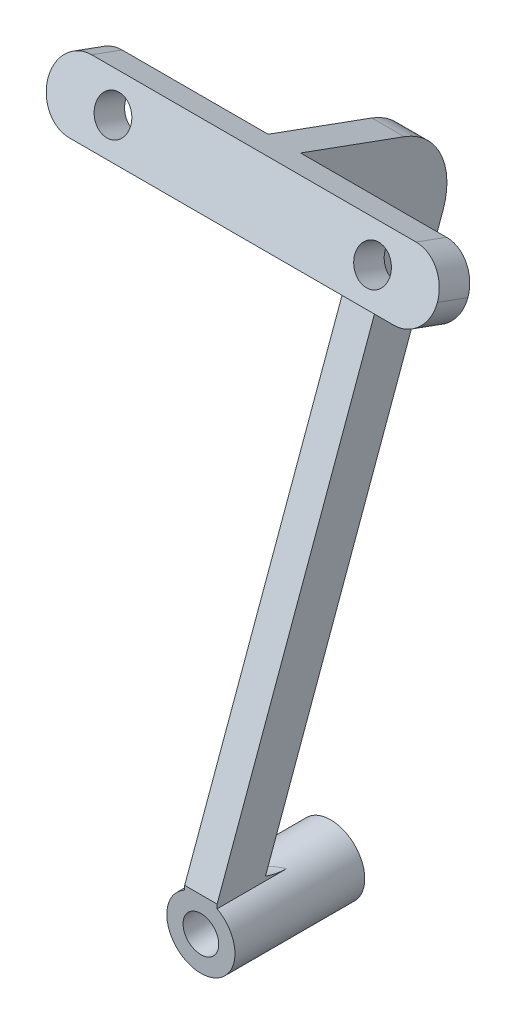
ISO-10303-21;
HEADER;
FILE_DESCRIPTION(('STEP AP214'),'2;1');
FILE_NAME('part.step','',(''),(''),'','','');
FILE_SCHEMA(('AUTOMOTIVE_DESIGN { 1 0 10303 214 1 1 1 1 }'));
ENDSEC;
DATA;
#1=APPLICATION_CONTEXT('core data for automotive mechanical design processes');
#2=APPLICATION_PROTOCOL_DEFINITION('international standard','automotive_design',2000,#1);
#3=PRODUCT_CONTEXT('',#1,'mechanical');
#4=PRODUCT('Part','Part','',(#3));
#5=PRODUCT_RELATED_PRODUCT_CATEGORY('part','',(#4));
#6=PRODUCT_DEFINITION_FORMATION('','',#4);
#7=PRODUCT_DEFINITION_CONTEXT('part definition',#1,'design');
#8=PRODUCT_DEFINITION('design','',#6,#7);
#9=PRODUCT_DEFINITION_SHAPE('','',#8);
#10=(LENGTH_UNIT() NAMED_UNIT(*) SI_UNIT(.MILLI.,.METRE.));
#11=(NAMED_UNIT(*) PLANE_ANGLE_UNIT() SI_UNIT($,.RADIAN.));
#12=(NAMED_UNIT(*) SI_UNIT($,.STERADIAN.) SOLID_ANGLE_UNIT());
#13=UNCERTAINTY_MEASURE_WITH_UNIT(LENGTH_MEASURE(1.E-05),#10,'distance_accuracy_value','');
#14=(GEOMETRIC_REPRESENTATION_CONTEXT(3) GLOBAL_UNCERTAINTY_ASSIGNED_CONTEXT((#13)) GLOBAL_UNIT_ASSIGNED_CONTEXT((#10,
#11,#12)) REPRESENTATION_CONTEXT('',''));
#15=CARTESIAN_POINT('',(0.,0.,0.));
#16=DIRECTION('',(0.,0.,1.));
#17=DIRECTION('',(1.,0.,0.));
#18=AXIS2_PLACEMENT_3D('',#15,#16,#17);
#19=CARTESIAN_POINT('',(-2.5,-5.251,20.));
#20=DIRECTION('',(1.,0.,0.));
#21=DIRECTION('',(0.,0.,-1.));
#22=AXIS2_PLACEMENT_3D('',#19,#20,#21);
#23=PLANE('',#22);
#24=DIRECTION('',(0.,-0.342020143325673,-0.939692620785907));
#25=VECTOR('',#24,1.);
#26=CARTESIAN_POINT('',(-2.5,85.1744674403331,-31.0009708677575));
#27=LINE('',#26,#25);
#28=CARTESIAN_POINT('',(-2.5,99.0568797405248,7.14064345457762));
#29=VERTEX_POINT('',#28);
#30=CARTESIAN_POINT('',(-2.5,93.2425373039883,-8.83413109878284));
#31=VERTEX_POINT('',#30);
#32=EDGE_CURVE('E200',#29,#31,#27,.T.);
#33=ORIENTED_EDGE('',*,*,#32,.T.);
#34=CARTESIAN_POINT('',(-2.5,83.8456110961293,-5.41392966552613));
#35=DIRECTION('',(1.,0.,0.));
#36=DIRECTION('',(0.,0.,-1.));
#37=AXIS2_PLACEMENT_3D('',#34,#35,#36);
#38=CIRCLE('',#37,10.);
#39=CARTESIAN_POINT('',(-2.5,80.4254096628726,-14.8108558733852));
#40=VERTEX_POINT('',#39);
#41=EDGE_CURVE('E240',#31,#40,#38,.F.);
#42=ORIENTED_EDGE('',*,*,#41,.T.);
#43=DIRECTION('',(0.,0.939692620785907,-0.342020143325673));
#44=VECTOR('',#43,1.);
#45=CARTESIAN_POINT('',(-2.5,4.64786843039844,12.7699135611156));
#46=LINE('',#45,#44);
#47=CARTESIAN_POINT('',(-2.5,5.25,12.5507555926686));
#48=VERTEX_POINT('',#47);
#49=EDGE_CURVE('E208',#48,#40,#46,.T.);
#50=ORIENTED_EDGE('',*,*,#49,.F.);
#51=CARTESIAN_POINT('',(0.,5.25,12.5507555926686));
#52=CARTESIAN_POINT('',(0.,5.25,12.5507555926686));
#53=CARTESIAN_POINT('',(0.,5.25,12.5507555926686));
#54=CARTESIAN_POINT('',(-0.00553342975282039,5.25,12.5507555926686));
#55=CARTESIAN_POINT('',(-0.00418381272475795,5.25000002703478,12.5488232350496));
#56=CARTESIAN_POINT('',(-0.00283419572705482,5.24999999850781,12.5468908780633));
#57=CARTESIAN_POINT('',(-0.0110669032605803,5.25,12.5507555926686));
#58=CARTESIAN_POINT('',(-0.00836766133980388,5.2499955453821,12.5468908609932));
#59=CARTESIAN_POINT('',(-0.00566841386517574,5.24999770351182,12.5430261325125));
#60=CARTESIAN_POINT('',(-0.36287299616643,5.25,12.5507555926686));
#61=CARTESIAN_POINT('',(-0.274377801040332,5.24942408783464,12.4240306705765));
#62=CARTESIAN_POINT('',(-0.185861778524241,5.24970596208985,12.2973143297875));
#63=CARTESIAN_POINT('',(-0.709301719851265,5.25,12.5507555926686));
#64=CARTESIAN_POINT('',(-0.536964722483506,5.2311889981498,12.3027906785226));
#65=CARTESIAN_POINT('',(-0.363300880897622,5.24043658856924,12.0553725040121));
#66=CARTESIAN_POINT('',(-1.4008943284433,5.25,12.5507555926686));
#67=CARTESIAN_POINT('',(-1.05574310249139,5.16001576655704,12.068202499425));
#68=CARTESIAN_POINT('',(-0.717531241399588,5.20378678969846,11.5743758696895));
#69=CARTESIAN_POINT('',(-1.74605671865242,5.25,12.5507555926686));
#70=CARTESIAN_POINT('',(-1.31326128969685,5.10667090515502,11.9542859496197));
#71=CARTESIAN_POINT('',(-0.894321733951118,5.17638935150038,11.3353239880996));
#72=CARTESIAN_POINT('',(-2.43325084165303,5.25,12.5507555926686));
#73=CARTESIAN_POINT('',(-1.81615321784004,4.96671404735562,11.7420890877089));
#74=CARTESIAN_POINT('',(-1.24629921157118,5.10309224864686,10.8635405964318));
#75=CARTESIAN_POINT('',(-2.77528269156858,5.25,12.5507555926686));
#76=CARTESIAN_POINT('',(-2.06273634263074,4.8793706516017,11.6434117235311));
#77=CARTESIAN_POINT('',(-1.42148625663009,5.05719327911377,10.6308088492503));
#78=CARTESIAN_POINT('',(-3.45398178233707,5.25,12.5507555926686));
#79=CARTESIAN_POINT('',(-2.53700064518898,4.6742541443722,11.4703669371185));
#80=CARTESIAN_POINT('',(-1.76911262018755,4.94631005022254,10.1756619095447));
#81=CARTESIAN_POINT('',(-3.79065457458332,5.25,12.5507555926686));
#82=CARTESIAN_POINT('',(-2.76567013103482,4.55546096238637,11.3959062264544));
#83=CARTESIAN_POINT('',(-1.94155478208264,4.88134710749936,9.95323551388124));
#84=CARTESIAN_POINT('',(-4.32982969634834,5.25,12.5507555926686));
#85=CARTESIAN_POINT('',(-3.11301366596122,4.34371398137302,11.3031729765876));
#86=CARTESIAN_POINT('',(-2.21771764936217,4.75999456349973,9.60499620939088));
#87=CARTESIAN_POINT('',(-4.53468524509315,5.25,12.5507555926686));
#88=CARTESIAN_POINT('',(-3.24152457220835,4.2571737597041,11.274198038496));
#89=CARTESIAN_POINT('',(-2.32264366215005,4.70973310616259,9.47459807314129));
#90=CARTESIAN_POINT('',(-4.96344155898174,5.25,12.5507555926686));
#91=CARTESIAN_POINT('',(-3.49997521621392,4.06621960161026,11.2295664360153));
#92=CARTESIAN_POINT('',(-2.54225055456799,4.59526418037215,9.20671117300475));
#93=CARTESIAN_POINT('',(-5.18692339187712,5.25,12.5507555926686));
#94=CARTESIAN_POINT('',(-3.62827635981799,3.96068359938063,11.2160742604182));
#95=CARTESIAN_POINT('',(-2.65671685913333,4.53012704278603,9.07004936159981));
#96=CARTESIAN_POINT('',(-5.62819464803826,5.25,12.5507555926686));
#97=CARTESIAN_POINT('',(-3.8658974509558,3.74458075863057,11.2122147202418));
#98=CARTESIAN_POINT('',(-2.88273384406418,4.38976566433096,8.80772461836784));
#99=CARTESIAN_POINT('',(-5.84598467948027,5.25,12.5507555926686));
#100=CARTESIAN_POINT('',(-3.97508980020116,3.63366591031011,11.2223243755363));
#101=CARTESIAN_POINT('',(-2.99428483593457,4.31454250647529,8.68206050802444));
#102=CARTESIAN_POINT('',(-6.27684830527241,5.25,12.5507555926686));
#103=CARTESIAN_POINT('',(-4.17152345502315,3.41201766887106,11.2696910700895));
#104=CARTESIAN_POINT('',(-3.21497108308392,4.15275594627297,8.44309098421151));
#105=CARTESIAN_POINT('',(-6.48984022712729,5.25,12.5507555926686));
#106=CARTESIAN_POINT('',(-4.25810542584749,3.30114444733093,11.3079552056831));
#107=CARTESIAN_POINT('',(-3.32406450610329,4.066073438173,8.32994216363537));
#108=CARTESIAN_POINT('',(-6.90673929801625,5.25,12.5507555926686));
#109=CARTESIAN_POINT('',(-4.40412516384092,3.09105882786623,11.4140355104022));
#110=CARTESIAN_POINT('',(-3.53759817623991,3.88173036544261,8.12123388599514));
#111=CARTESIAN_POINT('',(-7.11063084682752,5.25,12.5507555926686));
#112=CARTESIAN_POINT('',(-4.46288059805264,2.99204548969485,11.4827637294919));
#113=CARTESIAN_POINT('',(-3.64203043299983,3.78405188972199,8.02570381535891));
#114=CARTESIAN_POINT('',(-7.30872896155708,5.25,12.5507555926686));
#115=CARTESIAN_POINT('',(-4.50484645781398,2.90655538373677,11.5663403075083));
#116=CARTESIAN_POINT('',(-3.74349532177313,3.68086168931444,7.94096344285839));
#117=(BOUNDED_SURFACE() B_SPLINE_SURFACE(3,2,((#51,#52,#53),(#54,#55,#56),(#57,#58,#59),(#60,
#61,#62),(#63,#64,#65),(#66,#67,#68),(#69,#70,#71),(#72,#73,#74),(#75,#76,#77),(#78,#79,#80),
(#81,#82,#83),(#84,#85,#86),(#87,#88,#89),(#90,#91,#92),(#93,#94,#95),(#96,#97,#98),(#99,#100,
#101),(#102,#103,#104),(#105,#106,#107),(#108,#109,#110),(#111,#112,#113),(#114,#115,#116)),
.UNSPECIFIED.,.F.,.F.,.F.) B_SPLINE_SURFACE_WITH_KNOTS((4,2,2,2,2,2,2,2,2,2,4),(3,3),(0.,
0.0202484611934928,1.28734341605146,2.55562920553875,3.82386734861048,5.09069276285007,
5.87595797452175,6.74865211018151,7.62125261291826,8.50376477870381,9.38773583737556),(0.,1.),
.UNSPECIFIED.) GEOMETRIC_REPRESENTATION_ITEM() RATIONAL_B_SPLINE_SURFACE(((1.,1.,1.),(1.,
1.0000000002927,1.),(1.,0.9999996669557,1.),(1.,0.999957263650876,1.),(1.,0.998609099828485,1.),
(1.,0.993302577997672,1.),(1.,0.989341768080813,1.),(1.,0.978829391228942,1.),(1.,
0.972277921627967,1.),(1.,0.956640507178793,1.),(1.,0.94755739368857,1.),(1.,0.930889619163092,
1.),(1.,0.924047858478959,1.),(1.,0.908672914432254,1.),(1.,0.900036223144658,1.),(1.,
0.8817836776441,1.),(1.,0.87216792858671,1.),(1.,0.851999747337295,1.),(1.,0.841437916221261,
1.),(1.,0.819744977077257,1.),(1.,0.808612956833077,1.),(1.,0.797350176467293,1.))) REPRESENTATION_ITEM('') SURFACE());
#118=CARTESIAN_POINT('',(-2.5,5.25,12.5507555926686));
#119=CARTESIAN_POINT('',(-2.5,5.20123540039477,12.4186239600091));
#120=CARTESIAN_POINT('',(-2.5,5.15507246240411,12.2855342504619));
#121=CARTESIAN_POINT('',(-2.5,5.06797953116687,12.0176567952337));
#122=CARTESIAN_POINT('',(-2.5,5.02704941147575,11.8828690906692));
#123=CARTESIAN_POINT('',(-2.5,4.95072739576637,11.6127911650898));
#124=CARTESIAN_POINT('',(-2.5,4.91529745484317,11.4775116940587));
#125=CARTESIAN_POINT('',(-2.5,4.84976854443575,11.2056550244644));
#126=CARTESIAN_POINT('',(-2.5,4.81966996580496,11.0690777315278));
#127=CARTESIAN_POINT('',(-2.5,4.76506522078445,10.7947128272488));
#128=CARTESIAN_POINT('',(-2.5,4.74056269103237,10.6569244889481));
#129=CARTESIAN_POINT('',(-2.5,4.6976196652654,10.3804272396534));
#130=CARTESIAN_POINT('',(-2.5,4.6791780569643,10.2417185023409));
#131=CARTESIAN_POINT('',(-2.5,4.64883010635834,9.9625537754421));
#132=CARTESIAN_POINT('',(-2.5,4.63697206033586,9.82209240707794));
#133=CARTESIAN_POINT('',(-2.5,4.62084546195926,9.54065814823677));
#134=CARTESIAN_POINT('',(-2.5,4.61658143811805,9.39968500274315));
#135=CARTESIAN_POINT('',(-2.5,4.61654632815485,9.25865962318365));
#136=B_SPLINE_CURVE_WITH_KNOTS('',3,(#118,#119,#120,#121,#122,#123,#124,#125,#126,#127,#128,
#129,#130,#131,#132,#133,#134,#135),.UNSPECIFIED.,.F.,.F.,(4,2,2,2,2,2,2,2,4),(0.,
0.422498815114254,0.844987419141227,1.2644092063015,1.68386172944417,2.10358606646129,
2.52323333357745,2.94591972858706,3.36885809819478),.UNSPECIFIED.);
#137=CARTESIAN_POINT('',(-2.5,4.61654632815485,9.25865962318365));
#138=VERTEX_POINT('',#137);
#139=EDGE_CURVE('E316',#48,#138,#136,.T.);
#140=ORIENTED_EDGE('',*,*,#139,.T.);
#141=DIRECTION('',(0.,0.,-1.));
#142=VECTOR('',#141,1.);
#143=CARTESIAN_POINT('',(-2.5,4.61654632815485,20.));
#144=LINE('',#143,#142);
#145=CARTESIAN_POINT('',(-2.5,4.61654632815485,20.));
#146=VERTEX_POINT('',#145);
#147=EDGE_CURVE('E215',#146,#138,#144,.T.);
#148=ORIENTED_EDGE('',*,*,#147,.F.);
#149=DIRECTION('',(0.,1.,0.));
#150=VECTOR('',#149,1.);
#151=CARTESIAN_POINT('',(-2.5,-5.251,20.));
#152=LINE('',#151,#150);
#153=CARTESIAN_POINT('',(-2.5,5.25,20.));
#154=VERTEX_POINT('',#153);
#155=EDGE_CURVE('E218',#146,#154,#152,.T.);
#156=ORIENTED_EDGE('',*,*,#155,.T.);
#157=DIRECTION('',(0.,0.939692620785907,-0.342020143325673));
#158=VECTOR('',#157,1.);
#159=CARTESIAN_POINT('',(-2.5,7.04200943367815,19.3477619066169));
#160=LINE('',#159,#158);
#161=CARTESIAN_POINT('',(-2.5,73.4226244582933,-4.81280609462714));
#162=VERTEX_POINT('',#161);
#163=EDGE_CURVE('E194',#154,#162,#160,.T.);
#164=ORIENTED_EDGE('',*,*,#163,.T.);
#165=CARTESIAN_POINT('',(-2.5,76.84282589155,4.58412011323194));
#166=DIRECTION('',(1.,0.,0.));
#167=DIRECTION('',(0.,0.,-1.));
#168=AXIS2_PLACEMENT_3D('',#165,#166,#167);
#169=CIRCLE('',#168,10.);
#170=CARTESIAN_POINT('',(-2.5,86.239752099409,1.16391867997522));
#171=VERTEX_POINT('',#170);
#172=EDGE_CURVE('E181',#162,#171,#169,.T.);
#173=ORIENTED_EDGE('',*,*,#172,.T.);
#174=DIRECTION('',(0.,-0.342020143325672,-0.939692620785907));
#175=VECTOR('',#174,1.);
#176=CARTESIAN_POINT('',(-2.5,91.3700542492941,15.2593079917638));
#177=LINE('',#176,#175);
#178=CARTESIAN_POINT('',(-2.5,89.6599535326658,10.5608448878343));
#179=VERTEX_POINT('',#178);
#180=EDGE_CURVE('E161',#179,#171,#177,.T.);
#181=ORIENTED_EDGE('',*,*,#180,.F.);
#182=DIRECTION('',(0.,-0.939692620785907,0.342020143325672));
#183=VECTOR('',#182,1.);
#184=CARTESIAN_POINT('',(-2.5,2.81778651791728,42.1688087603774));
#185=LINE('',#184,#183);
#186=EDGE_CURVE('E170',#29,#179,#185,.T.);
#187=ORIENTED_EDGE('',*,*,#186,.F.);
#188=EDGE_LOOP('',(#33,#42,#50,#140,#148,#156,#164,#173,#181,#187));
#189=FACE_BOUND('',#188,.T.);
#190=ADVANCED_FACE('F37',(#189),#23,.F.);
#191=CARTESIAN_POINT('',(2.5,0.,0.));
#192=DIRECTION('',(1.,0.,0.));
#193=DIRECTION('',(0.,0.,-1.));
#194=AXIS2_PLACEMENT_3D('',#191,#192,#193);
#195=PLANE('',#194);
#196=DIRECTION('',(0.,0.939692620785907,-0.342020143325673));
#197=VECTOR('',#196,1.);
#198=CARTESIAN_POINT('',(2.5,4.64786843039844,12.7699135611156));
#199=LINE('',#198,#197);
#200=CARTESIAN_POINT('',(2.5,5.25,12.5507555926686));
#201=VERTEX_POINT('',#200);
#202=CARTESIAN_POINT('',(2.5,80.4254096628726,-14.8108558733852));
#203=VERTEX_POINT('',#202);
#204=EDGE_CURVE('E199',#201,#203,#199,.T.);
#205=ORIENTED_EDGE('',*,*,#204,.T.);
#206=CARTESIAN_POINT('',(2.5,83.8456110961293,-5.41392966552613));
#207=DIRECTION('',(1.,0.,0.));
#208=DIRECTION('',(0.,0.,-1.));
#209=AXIS2_PLACEMENT_3D('',#206,#207,#208);
#210=CIRCLE('',#209,10.);
#211=CARTESIAN_POINT('',(2.5,93.2425373039883,-8.83413109878284));
#212=VERTEX_POINT('',#211);
#213=EDGE_CURVE('E244',#203,#212,#210,.T.);
#214=ORIENTED_EDGE('',*,*,#213,.T.);
#215=DIRECTION('',(0.,-0.342020143325673,-0.939692620785907));
#216=VECTOR('',#215,1.);
#217=CARTESIAN_POINT('',(2.5,85.1744674403331,-31.0009708677575));
#218=LINE('',#217,#216);
#219=CARTESIAN_POINT('',(2.5,99.0568797405248,7.14064345457762));
#220=VERTEX_POINT('',#219);
#221=EDGE_CURVE('E203',#220,#212,#218,.T.);
#222=ORIENTED_EDGE('',*,*,#221,.F.);
#223=DIRECTION('',(0.,-0.939692620785907,0.342020143325672));
#224=VECTOR('',#223,1.);
#225=CARTESIAN_POINT('',(2.5,13.8824123001916,38.1416143223351));
#226=LINE('',#225,#224);
#227=CARTESIAN_POINT('',(2.5,89.6599535326658,10.5608448878343));
#228=VERTEX_POINT('',#227);
#229=EDGE_CURVE('E177',#220,#228,#226,.T.);
#230=ORIENTED_EDGE('',*,*,#229,.T.);
#231=DIRECTION('',(0.,-0.342020143325672,-0.939692620785907));
#232=VECTOR('',#231,1.);
#233=CARTESIAN_POINT('',(2.5,91.3700542492941,15.2593079917638));
#234=LINE('',#233,#232);
#235=CARTESIAN_POINT('',(2.5,86.239752099409,1.16391867997522));
#236=VERTEX_POINT('',#235);
#237=EDGE_CURVE('E183',#228,#236,#234,.T.);
#238=ORIENTED_EDGE('',*,*,#237,.T.);
#239=CARTESIAN_POINT('',(2.5,76.84282589155,4.58412011323194));
#240=DIRECTION('',(1.,0.,0.));
#241=DIRECTION('',(0.,0.,-1.));
#242=AXIS2_PLACEMENT_3D('',#239,#240,#241);
#243=CIRCLE('',#242,10.);
#244=CARTESIAN_POINT('',(2.5,73.4226244582933,-4.81280609462714));
#245=VERTEX_POINT('',#244);
#246=EDGE_CURVE('E246',#236,#245,#243,.F.);
#247=ORIENTED_EDGE('',*,*,#246,.T.);
#248=DIRECTION('',(0.,0.939692620785907,-0.342020143325673));
#249=VECTOR('',#248,1.);
#250=CARTESIAN_POINT('',(2.5,7.04200943367815,19.3477619066169));
#251=LINE('',#250,#249);
#252=CARTESIAN_POINT('',(2.5,5.25,20.));
#253=VERTEX_POINT('',#252);
#254=EDGE_CURVE('E196',#253,#245,#251,.T.);
#255=ORIENTED_EDGE('',*,*,#254,.F.);
#256=DIRECTION('',(0.,1.,0.));
#257=VECTOR('',#256,1.);
#258=CARTESIAN_POINT('',(2.5,-5.251,20.));
#259=LINE('',#258,#257);
#260=CARTESIAN_POINT('',(2.5,4.61654632815485,20.));
#261=VERTEX_POINT('',#260);
#262=EDGE_CURVE('E182',#261,#253,#259,.T.);
#263=ORIENTED_EDGE('',*,*,#262,.F.);
#264=DIRECTION('',(0.,0.,-1.));
#265=VECTOR('',#264,1.);
#266=CARTESIAN_POINT('',(2.5,4.61654632815485,20.));
#267=LINE('',#266,#265);
#268=CARTESIAN_POINT('',(2.5,4.61654632815485,9.25865962318385));
#269=VERTEX_POINT('',#268);
#270=EDGE_CURVE('E186',#269,#261,#267,.F.);
#271=ORIENTED_EDGE('',*,*,#270,.F.);
#272=CARTESIAN_POINT('',(0.,5.25,12.5507555926686));
#273=CARTESIAN_POINT('',(0.,5.25,12.5507555926686));
#274=CARTESIAN_POINT('',(0.,5.25,12.5507555926686));
#275=CARTESIAN_POINT('',(0.00283419572705567,5.24999999850781,12.5468908780633));
#276=CARTESIAN_POINT('',(0.0041838127247592,5.25000002703478,12.5488232350496));
#277=CARTESIAN_POINT('',(0.00553342975282202,5.25,12.5507555926686));
#278=CARTESIAN_POINT('',(0.00566841386517742,5.24999770351182,12.5430261325125));
#279=CARTESIAN_POINT('',(0.00836766133980634,5.2499955453821,12.5468908609932));
#280=CARTESIAN_POINT('',(0.0110669032605835,5.25,12.5507555926686));
#281=CARTESIAN_POINT('',(0.18586177852428,5.24970596208985,12.2973143297877));
#282=CARTESIAN_POINT('',(0.274377801040389,5.24942408783464,12.4240306705766));
#283=CARTESIAN_POINT('',(0.362872996166505,5.25,12.5507555926686));
#284=CARTESIAN_POINT('',(0.363300880897607,5.24043658856925,12.0553725040122));
#285=CARTESIAN_POINT('',(0.536964722483484,5.2311889981498,12.3027906785226));
#286=CARTESIAN_POINT('',(0.709301719851235,5.25,12.5507555926686));
#287=CARTESIAN_POINT('',(0.717531241399518,5.20378678969847,11.5743758696895));
#288=CARTESIAN_POINT('',(1.05574310249129,5.16001576655705,12.068202499425));
#289=CARTESIAN_POINT('',(1.40089432844316,5.25,12.5507555926686));
#290=CARTESIAN_POINT('',(0.894321733951047,5.1763893515004,11.3353239880996));
#291=CARTESIAN_POINT('',(1.31326128969675,5.10667090515504,11.9542859496197));
#292=CARTESIAN_POINT('',(1.74605671865228,5.25,12.5507555926686));
#293=CARTESIAN_POINT('',(1.2462992115711,5.10309224864688,10.8635405964319));
#294=CARTESIAN_POINT('',(1.81615321783992,4.96671404735566,11.742089087709));
#295=CARTESIAN_POINT('',(2.43325084165286,5.25,12.5507555926686));
#296=CARTESIAN_POINT('',(1.42148625662999,5.0571932791138,10.6308088492504));
#297=CARTESIAN_POINT('',(2.0627363426306,4.87937065160175,11.6434117235311));
#298=CARTESIAN_POINT('',(2.77528269156838,5.25,12.5507555926686));
#299=CARTESIAN_POINT('',(1.76911262018742,4.94631005022258,10.1756619095448));
#300=CARTESIAN_POINT('',(2.5370006451888,4.67425414437229,11.4703669371186));
#301=CARTESIAN_POINT('',(3.45398178233681,5.25,12.5507555926686));
#302=CARTESIAN_POINT('',(1.9415547820825,4.88134710749942,9.95323551388143));
#303=CARTESIAN_POINT('',(2.76567013103463,4.55546096238647,11.3959062264544));
#304=CARTESIAN_POINT('',(3.79065457458303,5.25,12.5507555926686));
#305=CARTESIAN_POINT('',(2.21771764936206,4.75999456349978,9.60499620939101));
#306=CARTESIAN_POINT('',(3.1130136659611,4.3437139813731,11.3031729765876));
#307=CARTESIAN_POINT('',(4.32982969634813,5.25,12.5507555926686));
#308=CARTESIAN_POINT('',(2.32264366215,4.70973310616262,9.47459807314135));
#309=CARTESIAN_POINT('',(3.24152457220829,4.25717375970414,11.274198038496));
#310=CARTESIAN_POINT('',(4.53468524509305,5.25,12.5507555926686));
#311=CARTESIAN_POINT('',(2.54225055456799,4.59526418037215,9.20671117300474));
#312=CARTESIAN_POINT('',(3.49997521621392,4.06621960161026,11.2295664360153));
#313=CARTESIAN_POINT('',(4.96344155898175,5.25,12.5507555926686));
#314=CARTESIAN_POINT('',(2.65671685913333,4.53012704278603,9.07004936159981));
#315=CARTESIAN_POINT('',(3.62827635981799,3.96068359938063,11.2160742604182));
#316=CARTESIAN_POINT('',(5.18692339187712,5.25,12.5507555926686));
#317=CARTESIAN_POINT('',(2.88273384406419,4.38976566433096,8.80772461836784));
#318=CARTESIAN_POINT('',(3.8658974509558,3.74458075863056,11.2122147202418));
#319=CARTESIAN_POINT('',(5.62819464803826,5.25,12.5507555926686));
#320=CARTESIAN_POINT('',(2.99428483593458,4.31454250647529,8.68206050802444));
#321=CARTESIAN_POINT('',(3.97508980020116,3.63366591031011,11.2223243755363));
#322=CARTESIAN_POINT('',(5.84598467948028,5.25,12.5507555926686));
#323=CARTESIAN_POINT('',(3.21497108308392,4.15275594627297,8.44309098421151));
#324=CARTESIAN_POINT('',(4.17152345502315,3.41201766887106,11.2696910700895));
#325=CARTESIAN_POINT('',(6.27684830527242,5.25,12.5507555926686));
#326=CARTESIAN_POINT('',(3.3240645061033,4.066073438173,8.32994216363537));
#327=CARTESIAN_POINT('',(4.25810542584749,3.30114444733093,11.3079552056831));
#328=CARTESIAN_POINT('',(6.4898402271273,5.25,12.5507555926686));
#329=CARTESIAN_POINT('',(3.53759817623991,3.88173036544261,8.12123388599514));
#330=CARTESIAN_POINT('',(4.40412516384092,3.09105882786623,11.4140355104022));
#331=CARTESIAN_POINT('',(6.90673929801625,5.25,12.5507555926686));
#332=CARTESIAN_POINT('',(3.64203043299983,3.78405188972199,8.02570381535891));
#333=CARTESIAN_POINT('',(4.46288059805264,2.99204548969485,11.4827637294919));
#334=CARTESIAN_POINT('',(7.11063084682752,5.25,12.5507555926686));
#335=CARTESIAN_POINT('',(3.74349532177313,3.68086168931444,7.94096344285839));
#336=CARTESIAN_POINT('',(4.50484645781398,2.90655538373677,11.5663403075083));
#337=CARTESIAN_POINT('',(7.30872896155708,5.25,12.5507555926686));
#338=(BOUNDED_SURFACE() B_SPLINE_SURFACE(3,2,((#272,#273,#274),(#275,#276,#277),(#278,#279,
#280),(#281,#282,#283),(#284,#285,#286),(#287,#288,#289),(#290,#291,#292),(#293,#294,#295),
(#296,#297,#298),(#299,#300,#301),(#302,#303,#304),(#305,#306,#307),(#308,#309,#310),(#311,#312,
#313),(#314,#315,#316),(#317,#318,#319),(#320,#321,#322),(#323,#324,#325),(#326,#327,#328),
(#329,#330,#331),(#332,#333,#334),(#335,#336,#337)),.UNSPECIFIED.,.F.,.F.,
.F.) B_SPLINE_SURFACE_WITH_KNOTS((4,2,2,2,2,2,2,2,2,2,4),(3,3),(0.,0.0202484611934929,
1.28734341605136,2.55562920553856,3.82386734861019,5.09069276284968,5.87595797452175,
6.74865211018151,7.62125261291827,8.50376477870382,9.38773583737556),(0.,1.),
.UNSPECIFIED.) GEOMETRIC_REPRESENTATION_ITEM() RATIONAL_B_SPLINE_SURFACE(((1.,1.,1.),(1.,
1.0000000002927,1.),(1.,0.9999996669557,1.),(1.,0.999957263650876,1.),(1.,0.998609099828486,1.),
(1.,0.993302577997673,1.),(1.,0.989341768080815,1.),(1.,0.978829391228945,1.),(1.,
0.972277921627971,1.),(1.,0.956640507178799,1.),(1.,0.947557393688578,1.),(1.,0.930889619163099,
1.),(1.,0.924047858478963,1.),(1.,0.908672914432254,1.),(1.,0.900036223144658,1.),(1.,
0.8817836776441,1.),(1.,0.87216792858671,1.),(1.,0.851999747337295,1.),(1.,0.841437916221261,
1.),(1.,0.819744977077257,1.),(1.,0.808612956833077,1.),(1.,0.797350176467293,1.))) REPRESENTATION_ITEM('') SURFACE());
#339=CARTESIAN_POINT('',(2.49999999999983,4.61654632815494,9.25865962318385));
#340=CARTESIAN_POINT('',(2.49999999999994,4.61655690081324,9.36496249859393));
#341=CARTESIAN_POINT('',(2.49999999999998,4.61898861553146,9.47124643461652));
#342=CARTESIAN_POINT('',(2.50000000000002,4.62829875656326,9.68358995859213));
#343=CARTESIAN_POINT('',(2.5,4.63517584166232,9.7896496045358));
#344=CARTESIAN_POINT('',(2.5,4.65297463600894,10.0013391612197));
#345=CARTESIAN_POINT('',(2.5,4.66389316220787,10.1069693441908));
#346=CARTESIAN_POINT('',(2.5,4.68946929586845,10.3177794066051));
#347=CARTESIAN_POINT('',(2.5,4.70412721553566,10.4229592477029));
#348=CARTESIAN_POINT('',(2.5,4.7529776984465,10.7355211835319));
#349=CARTESIAN_POINT('',(2.5,4.79224351298967,10.9421232987581));
#350=CARTESIAN_POINT('',(2.5,4.88304346082889,11.3526004335622));
#351=CARTESIAN_POINT('',(2.5,4.93457787548686,11.5564753904836));
#352=CARTESIAN_POINT('',(2.5,5.01088315799925,11.8253560764651));
#353=CARTESIAN_POINT('',(2.5,5.03044671058922,11.8918685442087));
#354=CARTESIAN_POINT('',(2.5,5.07083842782344,12.0244956530155));
#355=CARTESIAN_POINT('',(2.5,5.09166634683066,12.0906103686267));
#356=CARTESIAN_POINT('',(2.5,5.15619990294571,12.2887940501943));
#357=CARTESIAN_POINT('',(2.5,5.20182448294926,12.4202410628785));
#358=CARTESIAN_POINT('',(2.5,5.25,12.5507555926686));
#359=B_SPLINE_CURVE_WITH_KNOTS('',3,(#339,#340,#341,#342,#343,#344,#345,#346,#347,#348,#349,
#350,#351,#352,#353,#354,#355,#356,#357,#358),.UNSPECIFIED.,.F.,.F.,(4,2,2,2,2,2,2,2,2,4),(0.,
0.318853600339742,0.637611044103387,0.956117966098614,1.27465148925092,1.90511317606467,
2.53558932296348,2.74357054046476,2.95151148055929,3.36883137666996),.UNSPECIFIED.);
#360=EDGE_CURVE('E313',#269,#201,#359,.T.);
#361=ORIENTED_EDGE('',*,*,#360,.T.);
#362=EDGE_LOOP('',(#205,#214,#222,#230,#238,#247,#255,#263,#271,#361));
#363=FACE_BOUND('',#362,.T.);
#364=ADVANCED_FACE('F337',(#363),#195,.T.);
#365=CARTESIAN_POINT('',(2.5,7.04200943367815,19.3477619066169));
#366=DIRECTION('',(0.,0.342020143325672,0.939692620785907));
#367=DIRECTION('',(0.,-0.939692620785907,0.342020143325672));
#368=AXIS2_PLACEMENT_3D('',#365,#366,#367);
#369=PLANE('',#368);
#370=ORIENTED_EDGE('',*,*,#254,.T.);
#371=DIRECTION('',(1.,0.,0.));
#372=VECTOR('',#371,1.);
#373=CARTESIAN_POINT('',(2.5,73.4226244582932,-4.81280609462714));
#374=LINE('',#373,#372);
#375=EDGE_CURVE('E235',#245,#162,#374,.F.);
#376=ORIENTED_EDGE('',*,*,#375,.T.);
#377=ORIENTED_EDGE('',*,*,#163,.F.);
#378=DIRECTION('',(-1.,0.,0.));
#379=VECTOR('',#378,1.);
#380=CARTESIAN_POINT('',(-2.5,5.25,20.));
#381=LINE('',#380,#379);
#382=EDGE_CURVE('E220',#253,#154,#381,.T.);
#383=ORIENTED_EDGE('',*,*,#382,.F.);
#384=EDGE_LOOP('',(#370,#376,#377,#383));
#385=FACE_BOUND('',#384,.T.);
#386=ADVANCED_FACE('F274',(#385),#369,.T.);
#387=CARTESIAN_POINT('',(0.,0.,20.));
#388=DIRECTION('',(0.,0.,-1.));
#389=DIRECTION('',(-1.,0.,0.));
#390=AXIS2_PLACEMENT_3D('',#387,#388,#389);
#391=CYLINDRICAL_SURFACE('',#390,5.25);
#392=CARTESIAN_POINT('',(0.,0.,0.));
#393=DIRECTION('',(0.,0.,1.));
#394=DIRECTION('',(1.,0.,0.));
#395=AXIS2_PLACEMENT_3D('',#392,#393,#394);
#396=CIRCLE('',#395,5.25);
#397=CARTESIAN_POINT('',(5.25,0.,0.));
#398=VERTEX_POINT('',#397);
#399=EDGE_CURVE('E227',#398,#398,#396,.T.);
#400=ORIENTED_EDGE('',*,*,#399,.T.);
#401=EDGE_LOOP('',(#400));
#402=FACE_BOUND('',#401,.T.);
#403=ORIENTED_EDGE('',*,*,#147,.T.);
#404=CARTESIAN_POINT('',(-3.74349532177313,3.68086168931444,7.94096344285839));
#405=CARTESIAN_POINT('',(-3.64203043299983,3.78405188972199,8.02570381535891));
#406=CARTESIAN_POINT('',(-3.53759817623991,3.88173036544261,8.12123388599514));
#407=CARTESIAN_POINT('',(-3.32406450610329,4.066073438173,8.32994216363537));
#408=CARTESIAN_POINT('',(-3.21497108308392,4.15275594627297,8.44309098421151));
#409=CARTESIAN_POINT('',(-2.99428483593457,4.31454250647529,8.68206050802444));
#410=CARTESIAN_POINT('',(-2.88273384406418,4.38976566433096,8.80772461836785));
#411=CARTESIAN_POINT('',(-2.65671685913333,4.53012704278603,9.07004936159981));
#412=CARTESIAN_POINT('',(-2.54225055456799,4.59526418037215,9.20671117300474));
#413=CARTESIAN_POINT('',(-2.32264366215005,4.70973310616259,9.47459807314129));
#414=CARTESIAN_POINT('',(-2.21771764936217,4.75999456349973,9.60499620939089));
#415=CARTESIAN_POINT('',(-1.94155478208264,4.88134710749936,9.95323551388124));
#416=CARTESIAN_POINT('',(-1.76911262018755,4.94631005022254,10.1756619095447));
#417=CARTESIAN_POINT('',(-1.42148625663009,5.05719327911377,10.6308088492503));
#418=CARTESIAN_POINT('',(-1.24629921157118,5.10309224864686,10.8635405964318));
#419=CARTESIAN_POINT('',(-0.894321733951118,5.17638935150039,11.3353239880996));
#420=CARTESIAN_POINT('',(-0.71753124139959,5.20378678969847,11.5743758696895));
#421=CARTESIAN_POINT('',(-0.36330088089762,5.24043658856924,12.0553725040121));
#422=CARTESIAN_POINT('',(-0.185861778524234,5.24970596208983,12.2973143297876));
#423=CARTESIAN_POINT('',(-0.00566841386517573,5.24999770351182,12.5430261325125));
#424=CARTESIAN_POINT('',(-0.00283419572705481,5.24999999850781,12.5468908780633));
#425=CARTESIAN_POINT('',(0.,5.25,12.5507555926686));
#426=B_SPLINE_CURVE_WITH_KNOTS('',3,(#404,#405,#406,#407,#408,#409,#410,#411,#412,#413,#414,
#415,#416,#417,#418,#419,#420,#421,#422,#423,#424,#425),.UNSPECIFIED.,.F.,.F.,(4,2,2,2,2,2,2,2,
2,2,4),(0.,0.883971058671751,1.7664832244573,2.63908372719405,3.51177786285381,4.29704307452549,
5.56386848876508,6.83210663183681,8.1003924213241,9.36748737618207,9.38773583737556),.UNSPECIFIED.);
#427=CARTESIAN_POINT('',(0.,5.25,12.5507555926686));
#428=VERTEX_POINT('',#427);
#429=EDGE_CURVE('E258',#138,#428,#426,.T.);
#430=ORIENTED_EDGE('',*,*,#429,.T.);
#431=CARTESIAN_POINT('',(3.74349532177313,3.68086168931444,7.94096344285839));
#432=CARTESIAN_POINT('',(3.64203043299983,3.78405188972199,8.02570381535891));
#433=CARTESIAN_POINT('',(3.53759817623991,3.88173036544261,8.12123388599514));
#434=CARTESIAN_POINT('',(3.3240645061033,4.066073438173,8.32994216363537));
#435=CARTESIAN_POINT('',(3.21497108308392,4.15275594627297,8.44309098421151));
#436=CARTESIAN_POINT('',(2.99428483593458,4.31454250647528,8.68206050802444));
#437=CARTESIAN_POINT('',(2.88273384406419,4.38976566433096,8.80772461836784));
#438=CARTESIAN_POINT('',(2.65671685913333,4.53012704278603,9.07004936159981));
#439=CARTESIAN_POINT('',(2.54225055456799,4.59526418037215,9.20671117300474));
#440=CARTESIAN_POINT('',(2.32264366215,4.70973310616262,9.47459807314135));
#441=CARTESIAN_POINT('',(2.21771764936206,4.75999456349978,9.60499620939101));
#442=CARTESIAN_POINT('',(1.9415547820825,4.88134710749942,9.95323551388143));
#443=CARTESIAN_POINT('',(1.76911262018742,4.94631005022258,10.1756619095448));
#444=CARTESIAN_POINT('',(1.42148625662999,5.0571932791138,10.6308088492504));
#445=CARTESIAN_POINT('',(1.2462992115711,5.10309224864688,10.8635405964319));
#446=CARTESIAN_POINT('',(0.894321733951047,5.1763893515004,11.3353239880996));
#447=CARTESIAN_POINT('',(0.71753124139952,5.20378678969847,11.5743758696895));
#448=CARTESIAN_POINT('',(0.363300880897605,5.24043658856924,12.0553725040122));
#449=CARTESIAN_POINT('',(0.185861778524274,5.24970596208983,12.2973143297877));
#450=CARTESIAN_POINT('',(0.00566841386517742,5.24999770351182,12.5430261325125));
#451=CARTESIAN_POINT('',(0.00283419572705567,5.24999999850781,12.5468908780633));
#452=CARTESIAN_POINT('',(0.,5.25,12.5507555926686));
#453=B_SPLINE_CURVE_WITH_KNOTS('',3,(#431,#432,#433,#434,#435,#436,#437,#438,#439,#440,#441,
#442,#443,#444,#445,#446,#447,#448,#449,#450,#451,#452),.UNSPECIFIED.,.F.,.F.,(4,2,2,2,2,2,2,2,
2,2,4),(0.,0.883971058671744,1.76648322445729,2.63908372719405,3.51177786285381,
4.29704307452588,5.56386848876537,6.832106631837,8.1003924213242,9.36748737618207,
9.38773583737556),.UNSPECIFIED.);
#454=EDGE_CURVE('E249',#428,#269,#453,.F.);
#455=ORIENTED_EDGE('',*,*,#454,.T.);
#456=ORIENTED_EDGE('',*,*,#270,.T.);
#457=CARTESIAN_POINT('',(0.,0.,20.));
#458=DIRECTION('',(0.,0.,1.));
#459=DIRECTION('',(1.,0.,0.));
#460=AXIS2_PLACEMENT_3D('',#457,#458,#459);
#461=CIRCLE('',#460,5.25);
#462=EDGE_CURVE('E228',#146,#261,#461,.T.);
#463=ORIENTED_EDGE('',*,*,#462,.F.);
#464=EDGE_LOOP('',(#403,#430,#455,#456,#463));
#465=FACE_BOUND('',#464,.T.);
#466=ADVANCED_FACE('F268',(#402,#465),#391,.T.);
#467=CARTESIAN_POINT('',(0.,0.,20.));
#468=DIRECTION('',(0.,0.,1.));
#469=DIRECTION('',(1.,0.,0.));
#470=AXIS2_PLACEMENT_3D('',#467,#468,#469);
#471=PLANE('',#470);
#472=ORIENTED_EDGE('',*,*,#462,.T.);
#473=ORIENTED_EDGE('',*,*,#262,.T.);
#474=ORIENTED_EDGE('',*,*,#382,.T.);
#475=ORIENTED_EDGE('',*,*,#155,.F.);
#476=EDGE_LOOP('',(#472,#473,#474,#475));
#477=FACE_BOUND('',#476,.T.);
#478=CARTESIAN_POINT('',(0.,0.,20.));
#479=DIRECTION('',(0.,0.,1.));
#480=DIRECTION('',(1.,0.,0.));
#481=AXIS2_PLACEMENT_3D('',#478,#479,#480);
#482=CIRCLE('',#481,2.75);
#483=CARTESIAN_POINT('',(2.75,0.,20.));
#484=VERTEX_POINT('',#483);
#485=EDGE_CURVE('E217',#484,#484,#482,.T.);
#486=ORIENTED_EDGE('',*,*,#485,.F.);
#487=EDGE_LOOP('',(#486));
#488=FACE_BOUND('',#487,.T.);
#489=ADVANCED_FACE('F273',(#477,#488),#471,.T.);
#490=CARTESIAN_POINT('',(0.,0.,0.));
#491=DIRECTION('',(0.,0.,1.));
#492=DIRECTION('',(1.,0.,0.));
#493=AXIS2_PLACEMENT_3D('',#490,#491,#492);
#494=PLANE('',#493);
#495=CARTESIAN_POINT('',(0.,0.,0.));
#496=DIRECTION('',(0.,0.,1.));
#497=DIRECTION('',(1.,0.,0.));
#498=AXIS2_PLACEMENT_3D('',#495,#496,#497);
#499=CIRCLE('',#498,4.75);
#500=CARTESIAN_POINT('',(4.75,0.,0.));
#501=VERTEX_POINT('',#500);
#502=EDGE_CURVE('E45',#501,#501,#499,.T.);
#503=ORIENTED_EDGE('',*,*,#502,.T.);
#504=EDGE_LOOP('',(#503));
#505=FACE_BOUND('',#504,.T.);
#506=ORIENTED_EDGE('',*,*,#399,.F.);
#507=EDGE_LOOP('',(#506));
#508=FACE_BOUND('',#507,.T.);
#509=ADVANCED_FACE('F276',(#505,#508),#494,.F.);
#510=CARTESIAN_POINT('',(0.,0.,20.));
#511=DIRECTION('',(0.,0.,-1.));
#512=DIRECTION('',(-1.,0.,0.));
#513=AXIS2_PLACEMENT_3D('',#510,#511,#512);
#514=CYLINDRICAL_SURFACE('',#513,2.75);
#515=CARTESIAN_POINT('',(0.,0.,2.));
#516=DIRECTION('',(0.,0.,1.));
#517=DIRECTION('',(1.,0.,0.));
#518=AXIS2_PLACEMENT_3D('',#515,#516,#517);
#519=CIRCLE('',#518,2.75);
#520=CARTESIAN_POINT('',(2.75,0.,2.));
#521=VERTEX_POINT('',#520);
#522=EDGE_CURVE('E11',#521,#521,#519,.F.);
#523=ORIENTED_EDGE('',*,*,#522,.T.);
#524=EDGE_LOOP('',(#523));
#525=FACE_BOUND('',#524,.T.);
#526=ORIENTED_EDGE('',*,*,#485,.T.);
#527=EDGE_LOOP('',(#526));
#528=FACE_BOUND('',#527,.T.);
#529=ADVANCED_FACE('F349',(#525,#528),#514,.F.);
#530=CARTESIAN_POINT('',(2.5,4.64786843039844,12.7699135611156));
#531=DIRECTION('',(0.,0.342020143325673,0.939692620785907));
#532=DIRECTION('',(0.,-0.939692620785907,0.342020143325673));
#533=AXIS2_PLACEMENT_3D('',#530,#531,#532);
#534=PLANE('',#533);
#535=ORIENTED_EDGE('',*,*,#49,.T.);
#536=DIRECTION('',(-1.,0.,0.));
#537=VECTOR('',#536,1.);
#538=CARTESIAN_POINT('',(2.5,80.4254096628726,-14.8108558733852));
#539=LINE('',#538,#537);
#540=EDGE_CURVE('E242',#40,#203,#539,.F.);
#541=ORIENTED_EDGE('',*,*,#540,.T.);
#542=ORIENTED_EDGE('',*,*,#204,.F.);
#543=DIRECTION('',(-1.,0.,0.));
#544=VECTOR('',#543,1.);
#545=CARTESIAN_POINT('',(2.5,5.25,12.5507555926686));
#546=LINE('',#545,#544);
#547=EDGE_CURVE('E206',#201,#428,#546,.T.);
#548=ORIENTED_EDGE('',*,*,#547,.T.);
#549=DIRECTION('',(1.,0.,0.));
#550=VECTOR('',#549,1.);
#551=CARTESIAN_POINT('',(-2.5,5.25,12.5507555926686));
#552=LINE('',#551,#550);
#553=EDGE_CURVE('E214',#48,#428,#552,.T.);
#554=ORIENTED_EDGE('',*,*,#553,.F.);
#555=EDGE_LOOP('',(#535,#541,#542,#548,#554));
#556=FACE_BOUND('',#555,.T.);
#557=ADVANCED_FACE('F345',(#556),#534,.F.);
#558=CARTESIAN_POINT('',(2.5,85.1744674403331,-31.0009708677575));
#559=DIRECTION('',(0.,0.939692620785907,-0.342020143325673));
#560=DIRECTION('',(0.,0.342020143325673,0.939692620785907));
#561=AXIS2_PLACEMENT_3D('',#558,#559,#560);
#562=PLANE('',#561);
#563=DIRECTION('',(-1.,0.,0.));
#564=VECTOR('',#563,1.);
#565=CARTESIAN_POINT('',(30.,99.0568797405248,7.14064345457762));
#566=LINE('',#565,#564);
#567=CARTESIAN_POINT('',(-24.9999999999999,99.0568797405248,7.14064345457762));
#568=VERTEX_POINT('',#567);
#569=EDGE_CURVE('E166',#29,#568,#566,.T.);
#570=ORIENTED_EDGE('',*,*,#569,.T.);
#571=DIRECTION('',(0.,0.342020143325673,0.939692620785907));
#572=VECTOR('',#571,1.);
#573=CARTESIAN_POINT('',(-25.,85.1744674403331,-31.0009708677575));
#574=LINE('',#573,#572);
#575=CARTESIAN_POINT('',(-25.,100.766980457153,11.8391065585071));
#576=VERTEX_POINT('',#575);
#577=EDGE_CURVE('E408',#568,#576,#574,.T.);
#578=ORIENTED_EDGE('',*,*,#577,.T.);
#579=DIRECTION('',(-1.,0.,0.));
#580=VECTOR('',#579,1.);
#581=CARTESIAN_POINT('',(-2.5,100.766980457153,11.8391065585071));
#582=LINE('',#581,#580);
#583=CARTESIAN_POINT('',(25.,100.766980457153,11.8391065585071));
#584=VERTEX_POINT('',#583);
#585=EDGE_CURVE('E189',#584,#576,#582,.T.);
#586=ORIENTED_EDGE('',*,*,#585,.F.);
#587=DIRECTION('',(0.,0.342020143325673,0.939692620785907));
#588=VECTOR('',#587,1.);
#589=CARTESIAN_POINT('',(25.,85.1744674403331,-31.0009708677575));
#590=LINE('',#589,#588);
#591=CARTESIAN_POINT('',(25.,99.0568797405248,7.14064345457762));
#592=VERTEX_POINT('',#591);
#593=EDGE_CURVE('E60',#584,#592,#590,.F.);
#594=ORIENTED_EDGE('',*,*,#593,.T.);
#595=EDGE_CURVE('E632',#592,#220,#566,.T.);
#596=ORIENTED_EDGE('',*,*,#595,.T.);
#597=ORIENTED_EDGE('',*,*,#221,.T.);
#598=DIRECTION('',(-1.,0.,0.));
#599=VECTOR('',#598,1.);
#600=CARTESIAN_POINT('',(-2.5,93.2425373039883,-8.83413109878285));
#601=LINE('',#600,#599);
#602=EDGE_CURVE('E237',#212,#31,#601,.T.);
#603=ORIENTED_EDGE('',*,*,#602,.T.);
#604=ORIENTED_EDGE('',*,*,#32,.F.);
#605=EDGE_LOOP('',(#570,#578,#586,#594,#596,#597,#603,#604));
#606=FACE_BOUND('',#605,.T.);
#607=ADVANCED_FACE('F343',(#606),#562,.T.);
#608=CARTESIAN_POINT('',(-2.5,91.3700542492941,15.2593079917638));
#609=DIRECTION('',(0.,0.939692620785907,-0.342020143325672));
#610=DIRECTION('',(0.,0.342020143325672,0.939692620785907));
#611=AXIS2_PLACEMENT_3D('',#608,#609,#610);
#612=PLANE('',#611);
#613=DIRECTION('',(1.,0.,0.));
#614=VECTOR('',#613,1.);
#615=CARTESIAN_POINT('',(-2.5,91.3700542492941,15.2593079917638));
#616=LINE('',#615,#614);
#617=CARTESIAN_POINT('',(-25.,91.3700542492941,15.2593079917638));
#618=VERTEX_POINT('',#617);
#619=CARTESIAN_POINT('',(25.,91.3700542492941,15.2593079917638));
#620=VERTEX_POINT('',#619);
#621=EDGE_CURVE('E176',#618,#620,#616,.T.);
#622=ORIENTED_EDGE('',*,*,#621,.F.);
#623=DIRECTION('',(0.,0.342020143325672,0.939692620785907));
#624=VECTOR('',#623,1.);
#625=CARTESIAN_POINT('',(-25.,89.6599535326658,10.5608448878343));
#626=LINE('',#625,#624);
#627=CARTESIAN_POINT('',(-24.9999999999999,89.6599535326658,10.5608448878343));
#628=VERTEX_POINT('',#627);
#629=EDGE_CURVE('E164',#618,#628,#626,.F.);
#630=ORIENTED_EDGE('',*,*,#629,.T.);
#631=DIRECTION('',(1.,0.,0.));
#632=VECTOR('',#631,1.);
#633=CARTESIAN_POINT('',(30.,89.6599535326658,10.5608448878343));
#634=LINE('',#633,#632);
#635=EDGE_CURVE('E155',#628,#179,#634,.T.);
#636=ORIENTED_EDGE('',*,*,#635,.T.);
#637=ORIENTED_EDGE('',*,*,#180,.T.);
#638=DIRECTION('',(1.,0.,0.));
#639=VECTOR('',#638,1.);
#640=CARTESIAN_POINT('',(-2.5,86.239752099409,1.16391867997522));
#641=LINE('',#640,#639);
#642=EDGE_CURVE('E231',#171,#236,#641,.T.);
#643=ORIENTED_EDGE('',*,*,#642,.T.);
#644=ORIENTED_EDGE('',*,*,#237,.F.);
#645=CARTESIAN_POINT('',(25.,89.6599535326658,10.5608448878343));
#646=VERTEX_POINT('',#645);
#647=EDGE_CURVE('E167',#228,#646,#634,.T.);
#648=ORIENTED_EDGE('',*,*,#647,.T.);
#649=DIRECTION('',(0.,0.342020143325672,0.939692620785907));
#650=VECTOR('',#649,1.);
#651=CARTESIAN_POINT('',(25.,91.3700542492941,15.2593079917639));
#652=LINE('',#651,#650);
#653=EDGE_CURVE('E399',#646,#620,#652,.T.);
#654=ORIENTED_EDGE('',*,*,#653,.T.);
#655=EDGE_LOOP('',(#622,#630,#636,#637,#643,#644,#648,#654));
#656=FACE_BOUND('',#655,.T.);
#657=ADVANCED_FACE('F158',(#656),#612,.F.);
#658=CARTESIAN_POINT('',(0.,15.59251301682,42.8400774262646));
#659=DIRECTION('',(0.,0.342020143325673,0.939692620785907));
#660=DIRECTION('',(0.,-0.939692620785907,0.342020143325673));
#661=AXIS2_PLACEMENT_3D('',#658,#659,#660);
#662=PLANE('',#661);
#663=CARTESIAN_POINT('',(-20.,96.0685173532237,13.5492072751355));
#664=DIRECTION('',(0.,0.342020143325672,0.939692620785907));
#665=DIRECTION('',(0.,-0.939692620785907,0.342020143325672));
#666=AXIS2_PLACEMENT_3D('',#663,#664,#665);
#667=CIRCLE('',#666,2.74999999999999);
#668=CARTESIAN_POINT('',(-20.,93.4843626460625,14.4897626692811));
#669=VERTEX_POINT('',#668);
#670=EDGE_CURVE('E426',#669,#669,#667,.T.);
#671=ORIENTED_EDGE('',*,*,#670,.F.);
#672=EDGE_LOOP('',(#671));
#673=FACE_BOUND('',#672,.T.);
#674=CARTESIAN_POINT('',(20.,96.0685173532237,13.5492072751355));
#675=DIRECTION('',(0.,0.342020143325672,0.939692620785907));
#676=DIRECTION('',(0.,-0.939692620785907,0.342020143325672));
#677=AXIS2_PLACEMENT_3D('',#674,#675,#676);
#678=CIRCLE('',#677,2.74999999999999);
#679=CARTESIAN_POINT('',(20.,93.4843626460625,14.4897626692811));
#680=VERTEX_POINT('',#679);
#681=EDGE_CURVE('E644',#680,#680,#678,.T.);
#682=ORIENTED_EDGE('',*,*,#681,.F.);
#683=EDGE_LOOP('',(#682));
#684=FACE_BOUND('',#683,.T.);
#685=CARTESIAN_POINT('',(-25.,96.0685173532236,13.5492072751355));
#686=DIRECTION('',(0.,0.342020143325673,0.939692620785907));
#687=DIRECTION('',(0.,-0.939692620785907,0.342020143325673));
#688=AXIS2_PLACEMENT_3D('',#685,#686,#687);
#689=CIRCLE('',#688,5.);
#690=CARTESIAN_POINT('',(-30.,96.0685173532236,13.5492072751355));
#691=VERTEX_POINT('',#690);
#692=EDGE_CURVE('E393',#576,#691,#689,.T.);
#693=ORIENTED_EDGE('',*,*,#692,.T.);
#694=CARTESIAN_POINT('',(-25.,96.0685173532237,13.5492072751355));
#695=DIRECTION('',(0.,0.342020143325673,0.939692620785907));
#696=DIRECTION('',(0.,-0.939692620785907,0.342020143325673));
#697=AXIS2_PLACEMENT_3D('',#694,#695,#696);
#698=CIRCLE('',#697,5.);
#699=EDGE_CURVE('E397',#691,#618,#698,.T.);
#700=ORIENTED_EDGE('',*,*,#699,.T.);
#701=ORIENTED_EDGE('',*,*,#621,.T.);
#702=CARTESIAN_POINT('',(25.,96.0685173532237,13.5492072751355));
#703=DIRECTION('',(0.,0.342020143325673,0.939692620785907));
#704=DIRECTION('',(0.,-0.939692620785907,0.342020143325673));
#705=AXIS2_PLACEMENT_3D('',#702,#703,#704);
#706=CIRCLE('',#705,5.);
#707=CARTESIAN_POINT('',(30.,96.0685173532237,13.5492072751355));
#708=VERTEX_POINT('',#707);
#709=EDGE_CURVE('E389',#620,#708,#706,.T.);
#710=ORIENTED_EDGE('',*,*,#709,.T.);
#711=CARTESIAN_POINT('',(25.,96.0685173532236,13.5492072751355));
#712=DIRECTION('',(0.,0.342020143325673,0.939692620785907));
#713=DIRECTION('',(0.,-0.939692620785907,0.342020143325673));
#714=AXIS2_PLACEMENT_3D('',#711,#712,#713);
#715=CIRCLE('',#714,5.);
#716=EDGE_CURVE('E388',#708,#584,#715,.T.);
#717=ORIENTED_EDGE('',*,*,#716,.T.);
#718=ORIENTED_EDGE('',*,*,#585,.T.);
#719=EDGE_LOOP('',(#693,#700,#701,#710,#717,#718));
#720=FACE_BOUND('',#719,.T.);
#721=ADVANCED_FACE('F422',(#673,#684,#720),#662,.T.);
#722=CARTESIAN_POINT('',(0.,13.8824123001916,38.1416143223351));
#723=DIRECTION('',(0.,0.342020143325672,0.939692620785907));
#724=DIRECTION('',(0.,-0.939692620785907,0.342020143325672));
#725=AXIS2_PLACEMENT_3D('',#722,#723,#724);
#726=PLANE('',#725);
#727=CARTESIAN_POINT('',(20.,94.3584166365954,8.85074417120596));
#728=DIRECTION('',(0.,0.342020143325672,0.939692620785907));
#729=DIRECTION('',(0.,-0.939692620785907,0.342020143325672));
#730=AXIS2_PLACEMENT_3D('',#727,#728,#729);
#731=CIRCLE('',#730,2.74999999999999);
#732=CARTESIAN_POINT('',(20.,91.7742619294341,9.79129956535155));
#733=VERTEX_POINT('',#732);
#734=EDGE_CURVE('E420',#733,#733,#731,.T.);
#735=ORIENTED_EDGE('',*,*,#734,.T.);
#736=EDGE_LOOP('',(#735));
#737=FACE_BOUND('',#736,.T.);
#738=CARTESIAN_POINT('',(25.,94.3584166365953,8.85074417120598));
#739=DIRECTION('',(0.,0.342020143325672,0.939692620785907));
#740=DIRECTION('',(0.,-0.939692620785907,0.342020143325672));
#741=AXIS2_PLACEMENT_3D('',#738,#739,#740);
#742=CIRCLE('',#741,5.);
#743=CARTESIAN_POINT('',(30.,94.3584166365953,8.85074417120599));
#744=VERTEX_POINT('',#743);
#745=EDGE_CURVE('E52',#592,#744,#742,.F.);
#746=ORIENTED_EDGE('',*,*,#745,.T.);
#747=CARTESIAN_POINT('',(25.,94.3584166365953,8.85074417120597));
#748=DIRECTION('',(0.,0.342020143325672,0.939692620785907));
#749=DIRECTION('',(0.,-0.939692620785907,0.342020143325672));
#750=AXIS2_PLACEMENT_3D('',#747,#748,#749);
#751=CIRCLE('',#750,5.);
#752=EDGE_CURVE('E322',#744,#646,#751,.F.);
#753=ORIENTED_EDGE('',*,*,#752,.T.);
#754=ORIENTED_EDGE('',*,*,#647,.F.);
#755=ORIENTED_EDGE('',*,*,#229,.F.);
#756=ORIENTED_EDGE('',*,*,#595,.F.);
#757=EDGE_LOOP('',(#746,#753,#754,#755,#756));
#758=FACE_BOUND('',#757,.T.);
#759=ADVANCED_FACE('F412',(#737,#758),#726,.F.);
#760=CARTESIAN_POINT('',(-20.,94.3584166365954,8.85074417120596));
#761=DIRECTION('',(0.,0.342020143325672,0.939692620785907));
#762=DIRECTION('',(0.,-0.939692620785907,0.342020143325672));
#763=AXIS2_PLACEMENT_3D('',#760,#761,#762);
#764=CIRCLE('',#763,2.74999999999999);
#765=CARTESIAN_POINT('',(-20.,91.7742619294341,9.79129956535155));
#766=VERTEX_POINT('',#765);
#767=EDGE_CURVE('E647',#766,#766,#764,.T.);
#768=ORIENTED_EDGE('',*,*,#767,.T.);
#769=EDGE_LOOP('',(#768));
#770=FACE_BOUND('',#769,.T.);
#771=ORIENTED_EDGE('',*,*,#635,.F.);
#772=CARTESIAN_POINT('',(-25.,94.3584166365953,8.85074417120598));
#773=DIRECTION('',(0.,0.342020143325672,0.939692620785907));
#774=DIRECTION('',(0.,-0.939692620785907,0.342020143325672));
#775=AXIS2_PLACEMENT_3D('',#772,#773,#774);
#776=CIRCLE('',#775,5.);
#777=CARTESIAN_POINT('',(-30.,94.3584166365953,8.85074417120599));
#778=VERTEX_POINT('',#777);
#779=EDGE_CURVE('E405',#628,#778,#776,.F.);
#780=ORIENTED_EDGE('',*,*,#779,.T.);
#781=CARTESIAN_POINT('',(-25.,94.3584166365953,8.85074417120599));
#782=DIRECTION('',(0.,0.342020143325672,0.939692620785907));
#783=DIRECTION('',(0.,-0.939692620785907,0.342020143325672));
#784=AXIS2_PLACEMENT_3D('',#781,#782,#783);
#785=CIRCLE('',#784,5.);
#786=EDGE_CURVE('E403',#778,#568,#785,.F.);
#787=ORIENTED_EDGE('',*,*,#786,.T.);
#788=ORIENTED_EDGE('',*,*,#569,.F.);
#789=ORIENTED_EDGE('',*,*,#186,.T.);
#790=EDGE_LOOP('',(#771,#780,#787,#788,#789));
#791=FACE_BOUND('',#790,.T.);
#792=ADVANCED_FACE('F171',(#770,#791),#726,.F.);
#793=CARTESIAN_POINT('',(20.,96.0685173532237,13.5492072751355));
#794=DIRECTION('',(0.,0.342020143325672,0.939692620785907));
#795=DIRECTION('',(0.,-0.939692620785907,0.342020143325672));
#796=AXIS2_PLACEMENT_3D('',#793,#794,#795);
#797=CYLINDRICAL_SURFACE('',#796,2.74999999999999);
#798=ORIENTED_EDGE('',*,*,#681,.T.);
#799=EDGE_LOOP('',(#798));
#800=FACE_BOUND('',#799,.T.);
#801=ORIENTED_EDGE('',*,*,#734,.F.);
#802=EDGE_LOOP('',(#801));
#803=FACE_BOUND('',#802,.T.);
#804=ADVANCED_FACE('F482',(#800,#803),#797,.F.);
#805=CARTESIAN_POINT('',(-20.,96.0685173532237,13.5492072751355));
#806=DIRECTION('',(0.,0.342020143325672,0.939692620785907));
#807=DIRECTION('',(0.,-0.939692620785907,0.342020143325672));
#808=AXIS2_PLACEMENT_3D('',#805,#806,#807);
#809=CYLINDRICAL_SURFACE('',#808,2.74999999999999);
#810=ORIENTED_EDGE('',*,*,#670,.T.);
#811=EDGE_LOOP('',(#810));
#812=FACE_BOUND('',#811,.T.);
#813=ORIENTED_EDGE('',*,*,#767,.F.);
#814=EDGE_LOOP('',(#813));
#815=FACE_BOUND('',#814,.T.);
#816=ADVANCED_FACE('F474',(#812,#815),#809,.F.);
#817=CARTESIAN_POINT('',(-2.5,76.84282589155,4.58412011323194));
#818=DIRECTION('',(1.,0.,0.));
#819=DIRECTION('',(0.,0.,-1.));
#820=AXIS2_PLACEMENT_3D('',#817,#818,#819);
#821=CYLINDRICAL_SURFACE('',#820,10.);
#822=ORIENTED_EDGE('',*,*,#172,.F.);
#823=ORIENTED_EDGE('',*,*,#375,.F.);
#824=ORIENTED_EDGE('',*,*,#246,.F.);
#825=ORIENTED_EDGE('',*,*,#642,.F.);
#826=EDGE_LOOP('',(#822,#823,#824,#825));
#827=FACE_BOUND('',#826,.T.);
#828=ADVANCED_FACE('F278',(#827),#821,.F.);
#829=CARTESIAN_POINT('',(2.5,83.8456110961293,-5.41392966552613));
#830=DIRECTION('',(1.,0.,0.));
#831=DIRECTION('',(0.,0.,-1.));
#832=AXIS2_PLACEMENT_3D('',#829,#830,#831);
#833=CYLINDRICAL_SURFACE('',#832,10.);
#834=ORIENTED_EDGE('',*,*,#213,.F.);
#835=ORIENTED_EDGE('',*,*,#540,.F.);
#836=ORIENTED_EDGE('',*,*,#41,.F.);
#837=ORIENTED_EDGE('',*,*,#602,.F.);
#838=EDGE_LOOP('',(#834,#835,#836,#837));
#839=FACE_BOUND('',#838,.T.);
#840=ADVANCED_FACE('F385',(#839),#833,.T.);
#841=ORIENTED_EDGE('',*,*,#139,.F.);
#842=ORIENTED_EDGE('',*,*,#553,.T.);
#843=ORIENTED_EDGE('',*,*,#429,.F.);
#844=EDGE_LOOP('',(#841,#842,#843));
#845=FACE_BOUND('',#844,.T.);
#846=ADVANCED_FACE('F282',(#845),#117,.F.);
#847=CARTESIAN_POINT('',(-25.,80.4760043364036,-29.2908701511292));
#848=DIRECTION('',(0.,0.342020143325673,0.939692620785907));
#849=DIRECTION('',(0.,-0.939692620785907,0.342020143325673));
#850=AXIS2_PLACEMENT_3D('',#847,#848,#849);
#851=CYLINDRICAL_SURFACE('',#850,5.);
#852=ORIENTED_EDGE('',*,*,#577,.F.);
#853=ORIENTED_EDGE('',*,*,#786,.F.);
#854=DIRECTION('',(0.,0.342020143325673,0.939692620785907));
#855=VECTOR('',#854,1.);
#856=CARTESIAN_POINT('',(-30.,94.3584166365953,8.85074417120598));
#857=LINE('',#856,#855);
#858=EDGE_CURVE('E424',#691,#778,#857,.F.);
#859=ORIENTED_EDGE('',*,*,#858,.F.);
#860=ORIENTED_EDGE('',*,*,#692,.F.);
#861=EDGE_LOOP('',(#852,#853,#859,#860));
#862=FACE_BOUND('',#861,.T.);
#863=ADVANCED_FACE('F438',(#862),#851,.T.);
#864=CARTESIAN_POINT('',(-25.,94.3584166365953,8.85074417120598));
#865=DIRECTION('',(0.,-0.342020143325672,-0.939692620785907));
#866=DIRECTION('',(0.,0.939692620785907,-0.342020143325672));
#867=AXIS2_PLACEMENT_3D('',#864,#865,#866);
#868=CYLINDRICAL_SURFACE('',#867,5.);
#869=ORIENTED_EDGE('',*,*,#779,.F.);
#870=ORIENTED_EDGE('',*,*,#629,.F.);
#871=ORIENTED_EDGE('',*,*,#699,.F.);
#872=ORIENTED_EDGE('',*,*,#858,.T.);
#873=EDGE_LOOP('',(#869,#870,#871,#872));
#874=FACE_BOUND('',#873,.T.);
#875=ADVANCED_FACE('F435',(#874),#868,.T.);
#876=CARTESIAN_POINT('',(25.,94.3584166365953,8.85074417120598));
#877=DIRECTION('',(0.,0.342020143325673,0.939692620785907));
#878=DIRECTION('',(0.,-0.939692620785907,0.342020143325673));
#879=AXIS2_PLACEMENT_3D('',#876,#877,#878);
#880=CYLINDRICAL_SURFACE('',#879,5.);
#881=DIRECTION('',(0.,0.342020143325673,0.939692620785907));
#882=VECTOR('',#881,1.);
#883=CARTESIAN_POINT('',(30.,94.3584166365953,8.85074417120598));
#884=LINE('',#883,#882);
#885=EDGE_CURVE('E421',#744,#708,#884,.T.);
#886=ORIENTED_EDGE('',*,*,#885,.F.);
#887=ORIENTED_EDGE('',*,*,#745,.F.);
#888=ORIENTED_EDGE('',*,*,#593,.F.);
#889=ORIENTED_EDGE('',*,*,#716,.F.);
#890=EDGE_LOOP('',(#886,#887,#888,#889));
#891=FACE_BOUND('',#890,.T.);
#892=ADVANCED_FACE('F295',(#891),#880,.T.);
#893=CARTESIAN_POINT('',(25.,96.0685173532237,13.5492072751355));
#894=DIRECTION('',(0.,-0.342020143325672,-0.939692620785907));
#895=DIRECTION('',(0.,0.939692620785907,-0.342020143325672));
#896=AXIS2_PLACEMENT_3D('',#893,#894,#895);
#897=CYLINDRICAL_SURFACE('',#896,5.);
#898=ORIENTED_EDGE('',*,*,#752,.F.);
#899=ORIENTED_EDGE('',*,*,#885,.T.);
#900=ORIENTED_EDGE('',*,*,#709,.F.);
#901=ORIENTED_EDGE('',*,*,#653,.F.);
#902=EDGE_LOOP('',(#898,#899,#900,#901));
#903=FACE_BOUND('',#902,.T.);
#904=ADVANCED_FACE('F293',(#903),#897,.T.);
#905=ORIENTED_EDGE('',*,*,#454,.F.);
#906=ORIENTED_EDGE('',*,*,#547,.F.);
#907=ORIENTED_EDGE('',*,*,#360,.F.);
#908=EDGE_LOOP('',(#905,#906,#907));
#909=FACE_BOUND('',#908,.T.);
#910=ADVANCED_FACE('F287',(#909),#338,.F.);
#911=CARTESIAN_POINT('',(0.,0.,2.));
#912=DIRECTION('',(0.,0.,1.));
#913=DIRECTION('',(1.,0.,0.));
#914=AXIS2_PLACEMENT_3D('',#911,#912,#913);
#915=TOROIDAL_SURFACE('',#914,4.75,2.);
#916=ORIENTED_EDGE('',*,*,#522,.F.);
#917=EDGE_LOOP('',(#916));
#918=FACE_BOUND('',#917,.T.);
#919=ORIENTED_EDGE('',*,*,#502,.F.);
#920=EDGE_LOOP('',(#919));
#921=FACE_BOUND('',#920,.T.);
#922=ADVANCED_FACE('F39',(#918,#921),#915,.T.);
#923=CLOSED_SHELL('',(#190,#364,#386,#466,#489,#509,#529,#557,#607,#657,#721,#759,#792,#804,
#816,#828,#840,#846,#863,#875,#892,#904,#910,#922));
#924=MANIFOLD_SOLID_BREP('B2',#923);
#925=ADVANCED_BREP_SHAPE_REPRESENTATION('',(#18,#924),#14);
#926=SHAPE_DEFINITION_REPRESENTATION(#9,#925);
ENDSEC;
END-ISO-10303-21;
